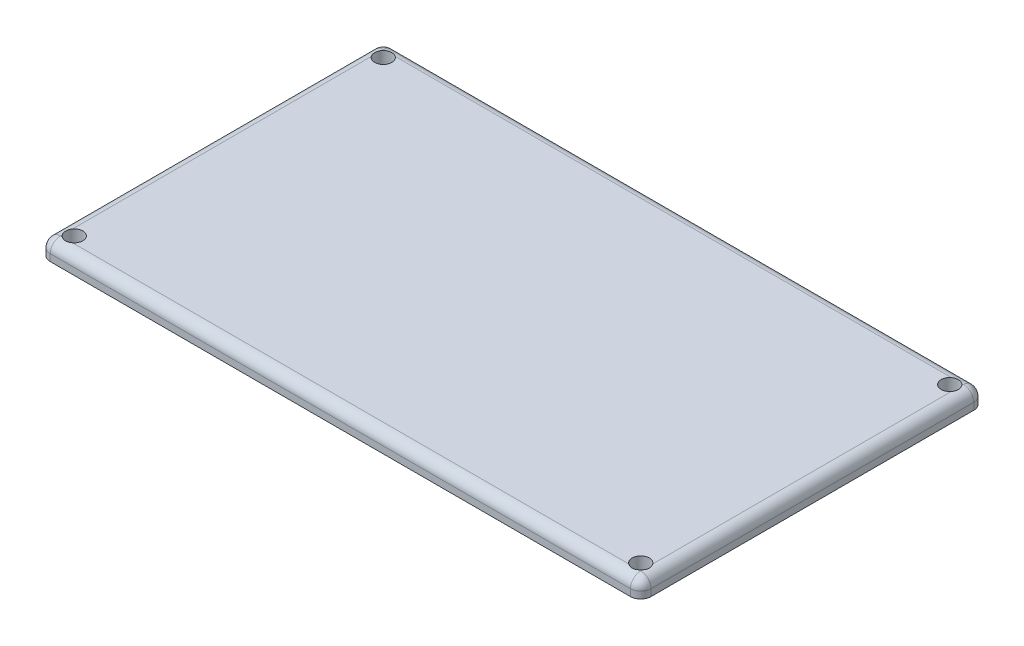
ISO-10303-21;
HEADER;
FILE_DESCRIPTION(('STEP AP214'),'2;1');
FILE_NAME('part.step','',(''),(''),'','','');
FILE_SCHEMA(('AUTOMOTIVE_DESIGN { 1 0 10303 214 1 1 1 1 }'));
ENDSEC;
DATA;
#1=APPLICATION_CONTEXT('core data for automotive mechanical design processes');
#2=APPLICATION_PROTOCOL_DEFINITION('international standard','automotive_design',2000,#1);
#3=PRODUCT_CONTEXT('',#1,'mechanical');
#4=PRODUCT('Part','Part','',(#3));
#5=PRODUCT_RELATED_PRODUCT_CATEGORY('part','',(#4));
#6=PRODUCT_DEFINITION_FORMATION('','',#4);
#7=PRODUCT_DEFINITION_CONTEXT('part definition',#1,'design');
#8=PRODUCT_DEFINITION('design','',#6,#7);
#9=PRODUCT_DEFINITION_SHAPE('','',#8);
#10=(LENGTH_UNIT() NAMED_UNIT(*) SI_UNIT(.MILLI.,.METRE.));
#11=(NAMED_UNIT(*) PLANE_ANGLE_UNIT() SI_UNIT($,.RADIAN.));
#12=(NAMED_UNIT(*) SI_UNIT($,.STERADIAN.) SOLID_ANGLE_UNIT());
#13=UNCERTAINTY_MEASURE_WITH_UNIT(LENGTH_MEASURE(1.E-05),#10,'distance_accuracy_value','');
#14=(GEOMETRIC_REPRESENTATION_CONTEXT(3) GLOBAL_UNCERTAINTY_ASSIGNED_CONTEXT((#13)) GLOBAL_UNIT_ASSIGNED_CONTEXT((#10,
#11,#12)) REPRESENTATION_CONTEXT('',''));
#15=CARTESIAN_POINT('',(0.,0.,0.));
#16=DIRECTION('',(0.,0.,1.));
#17=DIRECTION('',(1.,0.,0.));
#18=AXIS2_PLACEMENT_3D('',#15,#16,#17);
#19=CARTESIAN_POINT('',(0.,5.,0.));
#20=DIRECTION('',(0.,1.,0.));
#21=DIRECTION('',(0.,0.,1.));
#22=AXIS2_PLACEMENT_3D('',#19,#20,#21);
#23=PLANE('',#22);
#24=CARTESIAN_POINT('',(-82.5,5.,-45.));
#25=DIRECTION('',(0.,1.,0.));
#26=DIRECTION('',(0.,0.,1.));
#27=AXIS2_PLACEMENT_3D('',#24,#25,#26);
#28=CIRCLE('',#27,2.50000000000001);
#29=CARTESIAN_POINT('',(-84.5,5.,-43.5));
#30=VERTEX_POINT('',#29);
#31=CARTESIAN_POINT('',(-81.,5.,-47.));
#32=VERTEX_POINT('',#31);
#33=EDGE_CURVE('E165',#30,#32,#28,.T.);
#34=ORIENTED_EDGE('',*,*,#33,.F.);
#35=DIRECTION('',(0.,0.,1.));
#36=VECTOR('',#35,1.);
#37=CARTESIAN_POINT('',(-84.5,5.,50.));
#38=LINE('',#37,#36);
#39=CARTESIAN_POINT('',(-84.5,5.,43.5));
#40=VERTEX_POINT('',#39);
#41=EDGE_CURVE('E160',#30,#40,#38,.T.);
#42=ORIENTED_EDGE('',*,*,#41,.T.);
#43=CARTESIAN_POINT('',(-82.5,5.,45.));
#44=DIRECTION('',(0.,1.,0.));
#45=DIRECTION('',(0.,0.,-1.));
#46=AXIS2_PLACEMENT_3D('',#43,#44,#45);
#47=CIRCLE('',#46,2.5);
#48=CARTESIAN_POINT('',(-81.,5.,47.));
#49=VERTEX_POINT('',#48);
#50=EDGE_CURVE('E162',#49,#40,#47,.T.);
#51=ORIENTED_EDGE('',*,*,#50,.F.);
#52=DIRECTION('',(1.,0.,0.));
#53=VECTOR('',#52,1.);
#54=CARTESIAN_POINT('',(87.5,5.,47.));
#55=LINE('',#54,#53);
#56=CARTESIAN_POINT('',(81.,5.,47.));
#57=VERTEX_POINT('',#56);
#58=EDGE_CURVE('E275',#49,#57,#55,.T.);
#59=ORIENTED_EDGE('',*,*,#58,.T.);
#60=CARTESIAN_POINT('',(82.5,5.,45.));
#61=DIRECTION('',(0.,1.,0.));
#62=DIRECTION('',(0.,0.,1.));
#63=AXIS2_PLACEMENT_3D('',#60,#61,#62);
#64=CIRCLE('',#63,2.5);
#65=CARTESIAN_POINT('',(84.5,5.,43.5));
#66=VERTEX_POINT('',#65);
#67=EDGE_CURVE('E354',#66,#57,#64,.T.);
#68=ORIENTED_EDGE('',*,*,#67,.F.);
#69=DIRECTION('',(0.,0.,-1.));
#70=VECTOR('',#69,1.);
#71=CARTESIAN_POINT('',(84.5,5.,-50.));
#72=LINE('',#71,#70);
#73=CARTESIAN_POINT('',(84.5,5.,-43.5));
#74=VERTEX_POINT('',#73);
#75=EDGE_CURVE('E269',#66,#74,#72,.T.);
#76=ORIENTED_EDGE('',*,*,#75,.T.);
#77=CARTESIAN_POINT('',(82.5,5.,-45.));
#78=DIRECTION('',(0.,1.,0.));
#79=DIRECTION('',(0.,0.,-1.));
#80=AXIS2_PLACEMENT_3D('',#77,#78,#79);
#81=CIRCLE('',#80,2.50000000000001);
#82=CARTESIAN_POINT('',(81.,5.,-47.));
#83=VERTEX_POINT('',#82);
#84=EDGE_CURVE('E343',#83,#74,#81,.T.);
#85=ORIENTED_EDGE('',*,*,#84,.F.);
#86=DIRECTION('',(-1.,0.,0.));
#87=VECTOR('',#86,1.);
#88=CARTESIAN_POINT('',(-87.5,5.,-47.));
#89=LINE('',#88,#87);
#90=EDGE_CURVE('E257',#83,#32,#89,.T.);
#91=ORIENTED_EDGE('',*,*,#90,.T.);
#92=EDGE_LOOP('',(#34,#42,#51,#59,#68,#76,#85,#91));
#93=FACE_BOUND('',#92,.T.);
#94=ADVANCED_FACE('F34',(#93),#23,.T.);
#95=CARTESIAN_POINT('',(-84.5,5.,46.5));
#96=VERTEX_POINT('',#95);
#97=CARTESIAN_POINT('',(-83.9999999999999,5.,47.));
#98=VERTEX_POINT('',#97);
#99=EDGE_CURVE('E178',#96,#98,#47,.T.);
#100=ORIENTED_EDGE('',*,*,#99,.F.);
#101=DIRECTION('',(0.,0.,1.));
#102=VECTOR('',#101,1.);
#103=CARTESIAN_POINT('',(-84.5,5.,50.));
#104=LINE('',#103,#102);
#105=CARTESIAN_POINT('',(-84.5,5.,47.));
#106=VERTEX_POINT('',#105);
#107=EDGE_CURVE('E169',#96,#106,#104,.T.);
#108=ORIENTED_EDGE('',*,*,#107,.T.);
#109=DIRECTION('',(1.,0.,0.));
#110=VECTOR('',#109,1.);
#111=CARTESIAN_POINT('',(87.5,5.,47.));
#112=LINE('',#111,#110);
#113=EDGE_CURVE('E277',#106,#98,#112,.T.);
#114=ORIENTED_EDGE('',*,*,#113,.T.);
#115=EDGE_LOOP('',(#100,#108,#114));
#116=FACE_BOUND('',#115,.T.);
#117=ADVANCED_FACE('F281',(#116),#23,.T.);
#118=CARTESIAN_POINT('',(84.,5.,47.));
#119=VERTEX_POINT('',#118);
#120=CARTESIAN_POINT('',(84.5,5.,46.5));
#121=VERTEX_POINT('',#120);
#122=EDGE_CURVE('E348',#119,#121,#64,.T.);
#123=ORIENTED_EDGE('',*,*,#122,.F.);
#124=DIRECTION('',(1.,0.,0.));
#125=VECTOR('',#124,1.);
#126=CARTESIAN_POINT('',(87.5,5.,47.));
#127=LINE('',#126,#125);
#128=CARTESIAN_POINT('',(84.5,5.,47.));
#129=VERTEX_POINT('',#128);
#130=EDGE_CURVE('E273',#119,#129,#127,.T.);
#131=ORIENTED_EDGE('',*,*,#130,.T.);
#132=DIRECTION('',(0.,0.,-1.));
#133=VECTOR('',#132,1.);
#134=CARTESIAN_POINT('',(84.5,5.,-50.));
#135=LINE('',#134,#133);
#136=EDGE_CURVE('E271',#129,#121,#135,.T.);
#137=ORIENTED_EDGE('',*,*,#136,.T.);
#138=EDGE_LOOP('',(#123,#131,#137));
#139=FACE_BOUND('',#138,.T.);
#140=ADVANCED_FACE('F427',(#139),#23,.T.);
#141=CARTESIAN_POINT('',(84.5,5.,-46.5));
#142=VERTEX_POINT('',#141);
#143=CARTESIAN_POINT('',(84.,5.,-47.));
#144=VERTEX_POINT('',#143);
#145=EDGE_CURVE('E336',#142,#144,#81,.T.);
#146=ORIENTED_EDGE('',*,*,#145,.F.);
#147=DIRECTION('',(0.,0.,-1.));
#148=VECTOR('',#147,1.);
#149=CARTESIAN_POINT('',(84.5,5.,-50.));
#150=LINE('',#149,#148);
#151=CARTESIAN_POINT('',(84.5,5.,-47.));
#152=VERTEX_POINT('',#151);
#153=EDGE_CURVE('E267',#142,#152,#150,.T.);
#154=ORIENTED_EDGE('',*,*,#153,.T.);
#155=DIRECTION('',(-1.,0.,0.));
#156=VECTOR('',#155,1.);
#157=CARTESIAN_POINT('',(-87.5,5.,-47.));
#158=LINE('',#157,#156);
#159=EDGE_CURVE('E265',#152,#144,#158,.T.);
#160=ORIENTED_EDGE('',*,*,#159,.T.);
#161=EDGE_LOOP('',(#146,#154,#160));
#162=FACE_BOUND('',#161,.T.);
#163=ADVANCED_FACE('F335',(#162),#23,.T.);
#164=CARTESIAN_POINT('',(87.5,5.,-50.));
#165=DIRECTION('',(-1.,0.,0.));
#166=DIRECTION('',(0.,0.,1.));
#167=AXIS2_PLACEMENT_3D('',#164,#165,#166);
#168=PLANE('',#167);
#169=DIRECTION('',(0.,0.,-1.));
#170=VECTOR('',#169,1.);
#171=CARTESIAN_POINT('',(87.5,2.,50.));
#172=LINE('',#171,#170);
#173=CARTESIAN_POINT('',(87.5,2.,-47.));
#174=VERTEX_POINT('',#173);
#175=CARTESIAN_POINT('',(87.5,2.,47.));
#176=VERTEX_POINT('',#175);
#177=EDGE_CURVE('E461',#174,#176,#172,.F.);
#178=ORIENTED_EDGE('',*,*,#177,.T.);
#179=DIRECTION('',(0.,-1.,0.));
#180=VECTOR('',#179,1.);
#181=CARTESIAN_POINT('',(87.5,5.,47.));
#182=LINE('',#181,#180);
#183=CARTESIAN_POINT('',(87.5,0.,47.));
#184=VERTEX_POINT('',#183);
#185=EDGE_CURVE('E473',#176,#184,#182,.T.);
#186=ORIENTED_EDGE('',*,*,#185,.T.);
#187=DIRECTION('',(0.,0.,-1.));
#188=VECTOR('',#187,1.);
#189=CARTESIAN_POINT('',(87.5,0.,-50.));
#190=LINE('',#189,#188);
#191=CARTESIAN_POINT('',(87.5,0.,-47.));
#192=VERTEX_POINT('',#191);
#193=EDGE_CURVE('E359',#184,#192,#190,.T.);
#194=ORIENTED_EDGE('',*,*,#193,.T.);
#195=DIRECTION('',(0.,-1.,0.));
#196=VECTOR('',#195,1.);
#197=CARTESIAN_POINT('',(87.5,5.,-47.));
#198=LINE('',#197,#196);
#199=EDGE_CURVE('E407',#192,#174,#198,.F.);
#200=ORIENTED_EDGE('',*,*,#199,.T.);
#201=EDGE_LOOP('',(#178,#186,#194,#200));
#202=FACE_BOUND('',#201,.T.);
#203=ADVANCED_FACE('F438',(#202),#168,.F.);
#204=CARTESIAN_POINT('',(-87.5,5.,-50.));
#205=DIRECTION('',(0.,0.,1.));
#206=DIRECTION('',(1.,0.,0.));
#207=AXIS2_PLACEMENT_3D('',#204,#205,#206);
#208=PLANE('',#207);
#209=DIRECTION('',(-1.,0.,0.));
#210=VECTOR('',#209,1.);
#211=CARTESIAN_POINT('',(87.5,2.,-50.));
#212=LINE('',#211,#210);
#213=CARTESIAN_POINT('',(-84.5,2.,-50.));
#214=VERTEX_POINT('',#213);
#215=CARTESIAN_POINT('',(84.5,2.,-50.));
#216=VERTEX_POINT('',#215);
#217=EDGE_CURVE('E51',#214,#216,#212,.F.);
#218=ORIENTED_EDGE('',*,*,#217,.T.);
#219=DIRECTION('',(0.,-1.,0.));
#220=VECTOR('',#219,1.);
#221=CARTESIAN_POINT('',(84.5,5.,-50.));
#222=LINE('',#221,#220);
#223=CARTESIAN_POINT('',(84.5,0.,-50.));
#224=VERTEX_POINT('',#223);
#225=EDGE_CURVE('E479',#216,#224,#222,.T.);
#226=ORIENTED_EDGE('',*,*,#225,.T.);
#227=DIRECTION('',(-1.,0.,0.));
#228=VECTOR('',#227,1.);
#229=CARTESIAN_POINT('',(-87.5,0.,-50.));
#230=LINE('',#229,#228);
#231=CARTESIAN_POINT('',(-84.5,0.,-50.));
#232=VERTEX_POINT('',#231);
#233=EDGE_CURVE('E363',#224,#232,#230,.T.);
#234=ORIENTED_EDGE('',*,*,#233,.T.);
#235=DIRECTION('',(0.,-1.,0.));
#236=VECTOR('',#235,1.);
#237=CARTESIAN_POINT('',(-84.5,5.,-50.));
#238=LINE('',#237,#236);
#239=EDGE_CURVE('E56',#232,#214,#238,.F.);
#240=ORIENTED_EDGE('',*,*,#239,.T.);
#241=EDGE_LOOP('',(#218,#226,#234,#240));
#242=FACE_BOUND('',#241,.T.);
#243=ADVANCED_FACE('F443',(#242),#208,.F.);
#244=CARTESIAN_POINT('',(-87.5,5.,-50.));
#245=DIRECTION('',(1.,0.,0.));
#246=DIRECTION('',(0.,0.,-1.));
#247=AXIS2_PLACEMENT_3D('',#244,#245,#246);
#248=PLANE('',#247);
#249=DIRECTION('',(0.,0.,1.));
#250=VECTOR('',#249,1.);
#251=CARTESIAN_POINT('',(-87.5,0.,-50.));
#252=LINE('',#251,#250);
#253=CARTESIAN_POINT('',(-87.5,0.,-47.));
#254=VERTEX_POINT('',#253);
#255=CARTESIAN_POINT('',(-87.5,0.,47.));
#256=VERTEX_POINT('',#255);
#257=EDGE_CURVE('E260',#254,#256,#252,.T.);
#258=ORIENTED_EDGE('',*,*,#257,.T.);
#259=DIRECTION('',(0.,-1.,0.));
#260=VECTOR('',#259,1.);
#261=CARTESIAN_POINT('',(-87.5,5.,47.));
#262=LINE('',#261,#260);
#263=CARTESIAN_POINT('',(-87.5,2.,47.));
#264=VERTEX_POINT('',#263);
#265=EDGE_CURVE('E369',#256,#264,#262,.F.);
#266=ORIENTED_EDGE('',*,*,#265,.T.);
#267=DIRECTION('',(0.,0.,1.));
#268=VECTOR('',#267,1.);
#269=CARTESIAN_POINT('',(-87.5,2.,-50.));
#270=LINE('',#269,#268);
#271=CARTESIAN_POINT('',(-87.5,2.,-47.));
#272=VERTEX_POINT('',#271);
#273=EDGE_CURVE('E185',#264,#272,#270,.F.);
#274=ORIENTED_EDGE('',*,*,#273,.T.);
#275=DIRECTION('',(0.,-1.,0.));
#276=VECTOR('',#275,1.);
#277=CARTESIAN_POINT('',(-87.5,5.,-47.));
#278=LINE('',#277,#276);
#279=EDGE_CURVE('E183',#272,#254,#278,.T.);
#280=ORIENTED_EDGE('',*,*,#279,.T.);
#281=EDGE_LOOP('',(#258,#266,#274,#280));
#282=FACE_BOUND('',#281,.T.);
#283=ADVANCED_FACE('F368',(#282),#248,.F.);
#284=CARTESIAN_POINT('',(-87.5,5.,50.));
#285=DIRECTION('',(0.,0.,-1.));
#286=DIRECTION('',(-1.,0.,0.));
#287=AXIS2_PLACEMENT_3D('',#284,#285,#286);
#288=PLANE('',#287);
#289=DIRECTION('',(1.,0.,0.));
#290=VECTOR('',#289,1.);
#291=CARTESIAN_POINT('',(-87.5,0.,50.));
#292=LINE('',#291,#290);
#293=CARTESIAN_POINT('',(-84.5,0.,50.));
#294=VERTEX_POINT('',#293);
#295=CARTESIAN_POINT('',(84.5,0.,50.));
#296=VERTEX_POINT('',#295);
#297=EDGE_CURVE('E255',#294,#296,#292,.T.);
#298=ORIENTED_EDGE('',*,*,#297,.T.);
#299=DIRECTION('',(0.,-1.,0.));
#300=VECTOR('',#299,1.);
#301=CARTESIAN_POINT('',(84.5,5.,50.));
#302=LINE('',#301,#300);
#303=CARTESIAN_POINT('',(84.5,2.,50.));
#304=VERTEX_POINT('',#303);
#305=EDGE_CURVE('E467',#296,#304,#302,.F.);
#306=ORIENTED_EDGE('',*,*,#305,.T.);
#307=DIRECTION('',(1.,0.,0.));
#308=VECTOR('',#307,1.);
#309=CARTESIAN_POINT('',(-87.5,2.,50.));
#310=LINE('',#309,#308);
#311=CARTESIAN_POINT('',(-84.5,2.,50.));
#312=VERTEX_POINT('',#311);
#313=EDGE_CURVE('E455',#304,#312,#310,.F.);
#314=ORIENTED_EDGE('',*,*,#313,.T.);
#315=DIRECTION('',(0.,-1.,0.));
#316=VECTOR('',#315,1.);
#317=CARTESIAN_POINT('',(-84.5,5.,50.));
#318=LINE('',#317,#316);
#319=EDGE_CURVE('E465',#312,#294,#318,.T.);
#320=ORIENTED_EDGE('',*,*,#319,.T.);
#321=EDGE_LOOP('',(#298,#306,#314,#320));
#322=FACE_BOUND('',#321,.T.);
#323=ADVANCED_FACE('F429',(#322),#288,.F.);
#324=DIRECTION('',(-1.,0.,0.));
#325=VECTOR('',#324,1.);
#326=CARTESIAN_POINT('',(-87.5,5.,-47.));
#327=LINE('',#326,#325);
#328=CARTESIAN_POINT('',(-84.,5.,-47.));
#329=VERTEX_POINT('',#328);
#330=CARTESIAN_POINT('',(-84.5,5.,-47.));
#331=VERTEX_POINT('',#330);
#332=EDGE_CURVE('E244',#329,#331,#327,.T.);
#333=ORIENTED_EDGE('',*,*,#332,.T.);
#334=DIRECTION('',(0.,0.,1.));
#335=VECTOR('',#334,1.);
#336=CARTESIAN_POINT('',(-84.5,5.,50.));
#337=LINE('',#336,#335);
#338=CARTESIAN_POINT('',(-84.5,5.,-46.5));
#339=VERTEX_POINT('',#338);
#340=EDGE_CURVE('E247',#331,#339,#337,.T.);
#341=ORIENTED_EDGE('',*,*,#340,.T.);
#342=EDGE_CURVE('E238',#329,#339,#28,.T.);
#343=ORIENTED_EDGE('',*,*,#342,.F.);
#344=EDGE_LOOP('',(#333,#341,#343));
#345=FACE_BOUND('',#344,.T.);
#346=ADVANCED_FACE('F221',(#345),#23,.T.);
#347=CARTESIAN_POINT('',(0.,0.,0.));
#348=DIRECTION('',(0.,1.,0.));
#349=DIRECTION('',(0.,0.,1.));
#350=AXIS2_PLACEMENT_3D('',#347,#348,#349);
#351=PLANE('',#350);
#352=CARTESIAN_POINT('',(-82.5,0.,45.));
#353=DIRECTION('',(0.,1.,0.));
#354=DIRECTION('',(0.,0.,-1.));
#355=AXIS2_PLACEMENT_3D('',#352,#353,#354);
#356=CIRCLE('',#355,2.5);
#357=CARTESIAN_POINT('',(-82.5,0.,42.5));
#358=VERTEX_POINT('',#357);
#359=EDGE_CURVE('E355',#358,#358,#356,.T.);
#360=ORIENTED_EDGE('',*,*,#359,.T.);
#361=EDGE_LOOP('',(#360));
#362=FACE_BOUND('',#361,.T.);
#363=CARTESIAN_POINT('',(82.5,0.,45.));
#364=DIRECTION('',(0.,1.,0.));
#365=DIRECTION('',(0.,0.,1.));
#366=AXIS2_PLACEMENT_3D('',#363,#364,#365);
#367=CIRCLE('',#366,2.5);
#368=CARTESIAN_POINT('',(82.5,0.,47.5));
#369=VERTEX_POINT('',#368);
#370=EDGE_CURVE('E344',#369,#369,#367,.T.);
#371=ORIENTED_EDGE('',*,*,#370,.T.);
#372=EDGE_LOOP('',(#371));
#373=FACE_BOUND('',#372,.T.);
#374=CARTESIAN_POINT('',(82.5,0.,-45.));
#375=DIRECTION('',(0.,1.,0.));
#376=DIRECTION('',(0.,0.,-1.));
#377=AXIS2_PLACEMENT_3D('',#374,#375,#376);
#378=CIRCLE('',#377,2.50000000000001);
#379=CARTESIAN_POINT('',(82.5,0.,-47.5));
#380=VERTEX_POINT('',#379);
#381=EDGE_CURVE('E346',#380,#380,#378,.T.);
#382=ORIENTED_EDGE('',*,*,#381,.T.);
#383=EDGE_LOOP('',(#382));
#384=FACE_BOUND('',#383,.T.);
#385=CARTESIAN_POINT('',(-82.5,0.,-45.));
#386=DIRECTION('',(0.,1.,0.));
#387=DIRECTION('',(0.,0.,1.));
#388=AXIS2_PLACEMENT_3D('',#385,#386,#387);
#389=CIRCLE('',#388,2.50000000000001);
#390=CARTESIAN_POINT('',(-82.5,0.,-42.5));
#391=VERTEX_POINT('',#390);
#392=EDGE_CURVE('E248',#391,#391,#389,.T.);
#393=ORIENTED_EDGE('',*,*,#392,.T.);
#394=EDGE_LOOP('',(#393));
#395=FACE_BOUND('',#394,.T.);
#396=ORIENTED_EDGE('',*,*,#193,.F.);
#397=CARTESIAN_POINT('',(84.5,0.,47.));
#398=DIRECTION('',(0.,1.,0.));
#399=DIRECTION('',(0.,0.,1.));
#400=AXIS2_PLACEMENT_3D('',#397,#398,#399);
#401=CIRCLE('',#400,3.);
#402=EDGE_CURVE('E11',#184,#296,#401,.F.);
#403=ORIENTED_EDGE('',*,*,#402,.T.);
#404=ORIENTED_EDGE('',*,*,#297,.F.);
#405=CARTESIAN_POINT('',(-84.5,0.,47.));
#406=DIRECTION('',(0.,1.,0.));
#407=DIRECTION('',(0.,0.,1.));
#408=AXIS2_PLACEMENT_3D('',#405,#406,#407);
#409=CIRCLE('',#408,3.);
#410=EDGE_CURVE('E377',#294,#256,#409,.F.);
#411=ORIENTED_EDGE('',*,*,#410,.T.);
#412=ORIENTED_EDGE('',*,*,#257,.F.);
#413=CARTESIAN_POINT('',(-84.5,0.,-47.));
#414=DIRECTION('',(0.,1.,0.));
#415=DIRECTION('',(0.,0.,1.));
#416=AXIS2_PLACEMENT_3D('',#413,#414,#415);
#417=CIRCLE('',#416,3.);
#418=EDGE_CURVE('E481',#254,#232,#417,.F.);
#419=ORIENTED_EDGE('',*,*,#418,.T.);
#420=ORIENTED_EDGE('',*,*,#233,.F.);
#421=CARTESIAN_POINT('',(84.5,0.,-47.));
#422=DIRECTION('',(0.,1.,0.));
#423=DIRECTION('',(0.,0.,1.));
#424=AXIS2_PLACEMENT_3D('',#421,#422,#423);
#425=CIRCLE('',#424,3.);
#426=EDGE_CURVE('E43',#224,#192,#425,.F.);
#427=ORIENTED_EDGE('',*,*,#426,.T.);
#428=EDGE_LOOP('',(#396,#403,#404,#411,#412,#419,#420,#427));
#429=FACE_BOUND('',#428,.T.);
#430=ADVANCED_FACE('F219',(#362,#373,#384,#395,#429),#351,.F.);
#431=CARTESIAN_POINT('',(-82.5,0.,-45.));
#432=DIRECTION('',(0.,1.,0.));
#433=DIRECTION('',(0.,0.,1.));
#434=AXIS2_PLACEMENT_3D('',#431,#432,#433);
#435=CYLINDRICAL_SURFACE('',#434,2.50000000000001);
#436=ORIENTED_EDGE('',*,*,#392,.F.);
#437=EDGE_LOOP('',(#436));
#438=FACE_BOUND('',#437,.T.);
#439=ORIENTED_EDGE('',*,*,#342,.T.);
#440=CARTESIAN_POINT('',(-84.5,5.,-46.5));
#441=CARTESIAN_POINT('',(-84.5420704461217,4.99999332193425,-46.4439173670414));
#442=CARTESIAN_POINT('',(-84.5817619315182,4.99911482948799,-46.3860690408133));
#443=CARTESIAN_POINT('',(-84.6561314641283,4.99616721008799,-46.2672797058176));
#444=CARTESIAN_POINT('',(-84.6908106348321,4.99409835046975,-46.2063393942566));
#445=CARTESIAN_POINT('',(-84.7549209167581,4.98932235877924,-46.0817757626455));
#446=CARTESIAN_POINT('',(-84.7843517356934,4.98661519117833,-46.018152293411));
#447=CARTESIAN_POINT('',(-84.8377666928871,4.98104504226884,-45.8886831039609));
#448=CARTESIAN_POINT('',(-84.8617506359338,4.97818205538038,-45.8228373041959));
#449=CARTESIAN_POINT('',(-84.9252677665956,4.97001979214978,-45.6226069742142));
#450=CARTESIAN_POINT('',(-84.9564175077952,4.96514201351039,-45.4854297200601));
#451=CARTESIAN_POINT('',(-84.9952818209267,4.95889954464957,-45.2078766600723));
#452=CARTESIAN_POINT('',(-85.0030133308165,4.95753231542409,-45.0675032400393));
#453=CARTESIAN_POINT('',(-84.9949019595401,4.95889947246016,-44.7881247156143));
#454=CARTESIAN_POINT('',(-84.9791722381858,4.96161417100129,-44.6491162773595));
#455=CARTESIAN_POINT('',(-84.9248052662771,4.96989699091218,-44.3756890521871));
#456=CARTESIAN_POINT('',(-84.8861580065136,4.97546635891137,-44.2412722978274));
#457=CARTESIAN_POINT('',(-84.7951078574183,4.98573760713422,-44.0019515477298));
#458=CARTESIAN_POINT('',(-84.745962252363,4.99043333550333,-43.8958019606199));
#459=CARTESIAN_POINT('',(-84.661541089698,4.99577955942664,-43.7425648779645));
#460=CARTESIAN_POINT('',(-84.6316281765363,4.99727853114346,-43.6924987771515));
#461=CARTESIAN_POINT('',(-84.5683605533357,4.99938758489702,-43.5945517818845));
#462=CARTESIAN_POINT('',(-84.5350048616878,4.99999741266619,-43.546671516302));
#463=CARTESIAN_POINT('',(-84.5,5.,-43.5));
#464=B_SPLINE_CURVE_WITH_KNOTS('',3,(#440,#441,#442,#443,#444,#445,#446,#447,#448,#449,#450,
#451,#452,#453,#454,#455,#456,#457,#458,#459,#460,#461,#462,#463),.UNSPECIFIED.,.F.,.F.,(4,2,2,
2,2,2,2,2,2,2,2,4),(0.,0.210235486583612,0.420423776401091,0.63062376820268,0.840831292217668,
1.26091362427923,1.68069204620186,2.09845230086934,2.51639514637855,2.8663990104264,
3.04128920196876,3.21622939687739),.UNSPECIFIED.);
#465=EDGE_CURVE('E187',#339,#30,#464,.T.);
#466=ORIENTED_EDGE('',*,*,#465,.T.);
#467=ORIENTED_EDGE('',*,*,#33,.T.);
#468=CARTESIAN_POINT('',(-81.,5.,-47.));
#469=CARTESIAN_POINT('',(-81.0560826329586,4.99999332193425,-47.0420704461217));
#470=CARTESIAN_POINT('',(-81.1139309591867,4.99911482948799,-47.0817619315182));
#471=CARTESIAN_POINT('',(-81.2327202941824,4.99616721008799,-47.1561314641283));
#472=CARTESIAN_POINT('',(-81.2936606057434,4.99409835046975,-47.1908106348321));
#473=CARTESIAN_POINT('',(-81.4182242373545,4.98932235877924,-47.2549209167581));
#474=CARTESIAN_POINT('',(-81.481847706589,4.98661519117833,-47.2843517356934));
#475=CARTESIAN_POINT('',(-81.6113168960391,4.98104504226884,-47.3377666928871));
#476=CARTESIAN_POINT('',(-81.6771626958041,4.97818205538039,-47.3617506359338));
#477=CARTESIAN_POINT('',(-81.8773930257858,4.97001979214978,-47.4252677665956));
#478=CARTESIAN_POINT('',(-82.0145702799399,4.9651420135104,-47.4564175077952));
#479=CARTESIAN_POINT('',(-82.2921233399277,4.95889954464957,-47.4952818209267));
#480=CARTESIAN_POINT('',(-82.4324967599607,4.9575323154241,-47.5030133308165));
#481=CARTESIAN_POINT('',(-82.7118752843857,4.95889947246016,-47.4949019595401));
#482=CARTESIAN_POINT('',(-82.8508837226405,4.96161417100129,-47.4791722381858));
#483=CARTESIAN_POINT('',(-83.1243109478128,4.96989699091218,-47.4248052662771));
#484=CARTESIAN_POINT('',(-83.2587277021726,4.97546635891138,-47.3861580065136));
#485=CARTESIAN_POINT('',(-83.4980484522702,4.98573760713422,-47.2951078574183));
#486=CARTESIAN_POINT('',(-83.60419803938,4.99043333550333,-47.245962252363));
#487=CARTESIAN_POINT('',(-83.7574351220354,4.99577955942664,-47.161541089698));
#488=CARTESIAN_POINT('',(-83.8075012228484,4.99727853114346,-47.1316281765363));
#489=CARTESIAN_POINT('',(-83.9054482181154,4.99938758489702,-47.0683605533357));
#490=CARTESIAN_POINT('',(-83.9533284836979,4.99999741266619,-47.0350048616878));
#491=CARTESIAN_POINT('',(-84.,5.,-47.));
#492=B_SPLINE_CURVE_WITH_KNOTS('',3,(#468,#469,#470,#471,#472,#473,#474,#475,#476,#477,#478,
#479,#480,#481,#482,#483,#484,#485,#486,#487,#488,#489,#490,#491),.UNSPECIFIED.,.F.,.F.,(4,2,2,
2,2,2,2,2,2,2,2,4),(0.,0.210235486583606,0.420423776401103,0.630623768202701,0.840831292217678,
1.26091362427921,1.68069204620186,2.09845230086934,2.51639514637856,2.86639901042637,
3.04128920196871,3.21622939687733),.UNSPECIFIED.);
#493=EDGE_CURVE('E168',#32,#329,#492,.T.);
#494=ORIENTED_EDGE('',*,*,#493,.T.);
#495=EDGE_LOOP('',(#439,#466,#467,#494));
#496=FACE_BOUND('',#495,.T.);
#497=ADVANCED_FACE('F213',(#438,#496),#435,.F.);
#498=CARTESIAN_POINT('',(82.5,0.,-45.));
#499=DIRECTION('',(0.,1.,0.));
#500=DIRECTION('',(0.,0.,1.));
#501=AXIS2_PLACEMENT_3D('',#498,#499,#500);
#502=CYLINDRICAL_SURFACE('',#501,2.50000000000001);
#503=ORIENTED_EDGE('',*,*,#381,.F.);
#504=EDGE_LOOP('',(#503));
#505=FACE_BOUND('',#504,.T.);
#506=ORIENTED_EDGE('',*,*,#84,.T.);
#507=CARTESIAN_POINT('',(84.5,5.,-43.5));
#508=CARTESIAN_POINT('',(84.5420704461217,4.99999332193425,-43.5560826329586));
#509=CARTESIAN_POINT('',(84.5817619315183,4.99911482948799,-43.6139309591868));
#510=CARTESIAN_POINT('',(84.6561314641283,4.99616721008799,-43.7327202941824));
#511=CARTESIAN_POINT('',(84.6908106348321,4.99409835046975,-43.7936606057435));
#512=CARTESIAN_POINT('',(84.7549209167581,4.98932235877924,-43.9182242373546));
#513=CARTESIAN_POINT('',(84.7843517356934,4.98661519117833,-43.9818477065891));
#514=CARTESIAN_POINT('',(84.8377666928871,4.98104504226885,-44.1113168960391));
#515=CARTESIAN_POINT('',(84.8617506359338,4.97818205538039,-44.1771626958041));
#516=CARTESIAN_POINT('',(84.9252677665956,4.97001979214978,-44.3773930257859));
#517=CARTESIAN_POINT('',(84.9564175077952,4.9651420135104,-44.5145702799399));
#518=CARTESIAN_POINT('',(84.9952818209267,4.95889954464957,-44.7921233399278));
#519=CARTESIAN_POINT('',(85.0030133308165,4.9575323154241,-44.9324967599608));
#520=CARTESIAN_POINT('',(84.99490195954,4.95889947246016,-45.2118752843858));
#521=CARTESIAN_POINT('',(84.9791722381858,4.96161417100129,-45.3508837226405));
#522=CARTESIAN_POINT('',(84.9248052662771,4.96989699091219,-45.6243109478129));
#523=CARTESIAN_POINT('',(84.8861580065136,4.97546635891138,-45.7587277021727));
#524=CARTESIAN_POINT('',(84.7951078574182,4.98573760713422,-45.9980484522703));
#525=CARTESIAN_POINT('',(84.745962252363,4.99043333550333,-46.1041980393801));
#526=CARTESIAN_POINT('',(84.661541089698,4.99577955942664,-46.2574351220355));
#527=CARTESIAN_POINT('',(84.6316281765363,4.99727853114346,-46.3075012228484));
#528=CARTESIAN_POINT('',(84.5683605533357,4.99938758489703,-46.4054482181154));
#529=CARTESIAN_POINT('',(84.5350048616878,4.99999741266619,-46.453328483698));
#530=CARTESIAN_POINT('',(84.5,5.,-46.5));
#531=B_SPLINE_CURVE_WITH_KNOTS('',3,(#507,#508,#509,#510,#511,#512,#513,#514,#515,#516,#517,
#518,#519,#520,#521,#522,#523,#524,#525,#526,#527,#528,#529,#530),.UNSPECIFIED.,.F.,.F.,(4,2,2,
2,2,2,2,2,2,2,2,4),(0.,0.210235486583631,0.420423776401109,0.630623768202685,0.8408312922177,
1.26091362427924,1.68069204620189,2.09845230086936,2.51639514637859,2.86639901042637,
3.0412892019687,3.2162293968773),.UNSPECIFIED.);
#532=EDGE_CURVE('E342',#74,#142,#531,.T.);
#533=ORIENTED_EDGE('',*,*,#532,.T.);
#534=ORIENTED_EDGE('',*,*,#145,.T.);
#535=CARTESIAN_POINT('',(84.,5.,-47.));
#536=CARTESIAN_POINT('',(83.9439173670414,4.99999332193425,-47.0420704461217));
#537=CARTESIAN_POINT('',(83.8860690408133,4.99911482948799,-47.0817619315183));
#538=CARTESIAN_POINT('',(83.7672797058176,4.99616721008799,-47.1561314641283));
#539=CARTESIAN_POINT('',(83.7063393942566,4.99409835046975,-47.1908106348321));
#540=CARTESIAN_POINT('',(83.5817757626455,4.98932235877924,-47.2549209167581));
#541=CARTESIAN_POINT('',(83.5181522934109,4.98661519117833,-47.2843517356934));
#542=CARTESIAN_POINT('',(83.3886831039609,4.98104504226884,-47.3377666928871));
#543=CARTESIAN_POINT('',(83.3228373041959,4.97818205538038,-47.3617506359338));
#544=CARTESIAN_POINT('',(83.1226069742142,4.97001979214978,-47.4252677665956));
#545=CARTESIAN_POINT('',(82.9854297200601,4.96514201351039,-47.4564175077952));
#546=CARTESIAN_POINT('',(82.7078766600723,4.95889954464957,-47.4952818209267));
#547=CARTESIAN_POINT('',(82.5675032400393,4.95753231542409,-47.5030133308165));
#548=CARTESIAN_POINT('',(82.2881247156143,4.95889947246016,-47.4949019595401));
#549=CARTESIAN_POINT('',(82.1491162773595,4.96161417100129,-47.4791722381858));
#550=CARTESIAN_POINT('',(81.8756890521871,4.96989699091218,-47.4248052662771));
#551=CARTESIAN_POINT('',(81.7412722978274,4.97546635891138,-47.3861580065136));
#552=CARTESIAN_POINT('',(81.5019515477297,4.98573760713422,-47.2951078574183));
#553=CARTESIAN_POINT('',(81.3958019606199,4.99043333550333,-47.245962252363));
#554=CARTESIAN_POINT('',(81.2425648779645,4.99577955942664,-47.161541089698));
#555=CARTESIAN_POINT('',(81.1924987771515,4.99727853114346,-47.1316281765363));
#556=CARTESIAN_POINT('',(81.0945517818845,4.99938758489702,-47.0683605533357));
#557=CARTESIAN_POINT('',(81.046671516302,4.99999741266619,-47.0350048616878));
#558=CARTESIAN_POINT('',(81.,5.,-47.));
#559=B_SPLINE_CURVE_WITH_KNOTS('',3,(#535,#536,#537,#538,#539,#540,#541,#542,#543,#544,#545,
#546,#547,#548,#549,#550,#551,#552,#553,#554,#555,#556,#557,#558),.UNSPECIFIED.,.F.,.F.,(4,2,2,
2,2,2,2,2,2,2,2,4),(0.,0.210235486583621,0.420423776401106,0.630623768202704,0.840831292217684,
1.26091362427921,1.68069204620187,2.09845230086936,2.51639514637857,2.86639901042642,
3.04128920196878,3.2162293968774),.UNSPECIFIED.);
#560=EDGE_CURVE('E331',#144,#83,#559,.T.);
#561=ORIENTED_EDGE('',*,*,#560,.T.);
#562=EDGE_LOOP('',(#506,#533,#534,#561));
#563=FACE_BOUND('',#562,.T.);
#564=ADVANCED_FACE('F218',(#505,#563),#502,.F.);
#565=CARTESIAN_POINT('',(82.5,0.,45.));
#566=DIRECTION('',(0.,1.,0.));
#567=DIRECTION('',(0.,0.,1.));
#568=AXIS2_PLACEMENT_3D('',#565,#566,#567);
#569=CYLINDRICAL_SURFACE('',#568,2.5);
#570=ORIENTED_EDGE('',*,*,#370,.F.);
#571=EDGE_LOOP('',(#570));
#572=FACE_BOUND('',#571,.T.);
#573=ORIENTED_EDGE('',*,*,#67,.T.);
#574=CARTESIAN_POINT('',(81.,5.,47.));
#575=CARTESIAN_POINT('',(81.0560826329586,4.99999332193426,47.0420704461217));
#576=CARTESIAN_POINT('',(81.1139309591868,4.99911482948799,47.0817619315182));
#577=CARTESIAN_POINT('',(81.2327202941824,4.99616721008799,47.1561314641283));
#578=CARTESIAN_POINT('',(81.2936606057434,4.99409835046975,47.1908106348321));
#579=CARTESIAN_POINT('',(81.4182242373546,4.98932235877924,47.2549209167581));
#580=CARTESIAN_POINT('',(81.4818477065891,4.98661519117833,47.2843517356934));
#581=CARTESIAN_POINT('',(81.6113168960391,4.98104504226884,47.3377666928871));
#582=CARTESIAN_POINT('',(81.6771626958041,4.97818205538039,47.3617506359338));
#583=CARTESIAN_POINT('',(81.8773930257858,4.97001979214978,47.4252677665956));
#584=CARTESIAN_POINT('',(82.0145702799399,4.9651420135104,47.4564175077952));
#585=CARTESIAN_POINT('',(82.2921233399277,4.95889954464957,47.4952818209267));
#586=CARTESIAN_POINT('',(82.4324967599607,4.9575323154241,47.5030133308165));
#587=CARTESIAN_POINT('',(82.7118752843858,4.95889947246016,47.4949019595401));
#588=CARTESIAN_POINT('',(82.8508837226405,4.96161417100129,47.4791722381858));
#589=CARTESIAN_POINT('',(83.1243109478129,4.96989699091219,47.4248052662771));
#590=CARTESIAN_POINT('',(83.2587277021726,4.97546635891138,47.3861580065136));
#591=CARTESIAN_POINT('',(83.4980484522702,4.98573760713422,47.2951078574182));
#592=CARTESIAN_POINT('',(83.6041980393801,4.99043333550333,47.245962252363));
#593=CARTESIAN_POINT('',(83.7574351220354,4.99577955942664,47.161541089698));
#594=CARTESIAN_POINT('',(83.8075012228484,4.99727853114346,47.1316281765363));
#595=CARTESIAN_POINT('',(83.9054482181154,4.99938758489703,47.0683605533357));
#596=CARTESIAN_POINT('',(83.9533284836979,4.99999741266619,47.0350048616878));
#597=CARTESIAN_POINT('',(84.,5.,47.));
#598=B_SPLINE_CURVE_WITH_KNOTS('',3,(#574,#575,#576,#577,#578,#579,#580,#581,#582,#583,#584,
#585,#586,#587,#588,#589,#590,#591,#592,#593,#594,#595,#596,#597),.UNSPECIFIED.,.F.,.F.,(4,2,2,
2,2,2,2,2,2,2,2,4),(0.,0.210235486583606,0.420423776401103,0.630623768202698,0.840831292217678,
1.26091362427919,1.68069204620186,2.09845230086934,2.51639514637856,2.86639901042635,
3.0412892019687,3.2162293968773),.UNSPECIFIED.);
#599=EDGE_CURVE('E380',#57,#119,#598,.T.);
#600=ORIENTED_EDGE('',*,*,#599,.T.);
#601=ORIENTED_EDGE('',*,*,#122,.T.);
#602=CARTESIAN_POINT('',(84.5,5.,46.5));
#603=CARTESIAN_POINT('',(84.5420704461217,4.99999332193425,46.4439173670413));
#604=CARTESIAN_POINT('',(84.5817619315182,4.99911482948799,46.3860690408132));
#605=CARTESIAN_POINT('',(84.6561314641283,4.99616721008799,46.2672797058176));
#606=CARTESIAN_POINT('',(84.6908106348321,4.99409835046975,46.2063393942565));
#607=CARTESIAN_POINT('',(84.7549209167581,4.98932235877924,46.0817757626454));
#608=CARTESIAN_POINT('',(84.7843517356934,4.98661519117833,46.0181522934109));
#609=CARTESIAN_POINT('',(84.8377666928871,4.98104504226885,45.8886831039609));
#610=CARTESIAN_POINT('',(84.8617506359338,4.97818205538039,45.8228373041959));
#611=CARTESIAN_POINT('',(84.9252677665956,4.97001979214978,45.6226069742141));
#612=CARTESIAN_POINT('',(84.9564175077952,4.9651420135104,45.4854297200601));
#613=CARTESIAN_POINT('',(84.9952818209267,4.95889954464957,45.2078766600722));
#614=CARTESIAN_POINT('',(85.0030133308165,4.9575323154241,45.0675032400392));
#615=CARTESIAN_POINT('',(84.9949019595401,4.95889947246016,44.7881247156142));
#616=CARTESIAN_POINT('',(84.9791722381858,4.96161417100129,44.6491162773595));
#617=CARTESIAN_POINT('',(84.9248052662771,4.96989699091219,44.3756890521871));
#618=CARTESIAN_POINT('',(84.8861580065136,4.97546635891138,44.2412722978274));
#619=CARTESIAN_POINT('',(84.7951078574182,4.98573760713422,44.0019515477297));
#620=CARTESIAN_POINT('',(84.745962252363,4.99043333550333,43.8958019606199));
#621=CARTESIAN_POINT('',(84.661541089698,4.99577955942664,43.7425648779645));
#622=CARTESIAN_POINT('',(84.6316281765363,4.99727853114346,43.6924987771516));
#623=CARTESIAN_POINT('',(84.5683605533357,4.99938758489703,43.5945517818846));
#624=CARTESIAN_POINT('',(84.5350048616878,4.99999741266619,43.546671516302));
#625=CARTESIAN_POINT('',(84.5,5.,43.5));
#626=B_SPLINE_CURVE_WITH_KNOTS('',3,(#602,#603,#604,#605,#606,#607,#608,#609,#610,#611,#612,
#613,#614,#615,#616,#617,#618,#619,#620,#621,#622,#623,#624,#625),.UNSPECIFIED.,.F.,.F.,(4,2,2,
2,2,2,2,2,2,2,2,4),(0.,0.210235486583617,0.420423776401102,0.630623768202685,0.840831292217669,
1.26091362427922,1.68069204620185,2.09845230086932,2.51639514637855,2.86639901042636,
3.04128920196869,3.2162293968773),.UNSPECIFIED.);
#627=EDGE_CURVE('E378',#121,#66,#626,.T.);
#628=ORIENTED_EDGE('',*,*,#627,.T.);
#629=EDGE_LOOP('',(#573,#600,#601,#628));
#630=FACE_BOUND('',#629,.T.);
#631=ADVANCED_FACE('F209',(#572,#630),#569,.F.);
#632=CARTESIAN_POINT('',(-82.5,0.,45.));
#633=DIRECTION('',(0.,1.,0.));
#634=DIRECTION('',(0.,0.,1.));
#635=AXIS2_PLACEMENT_3D('',#632,#633,#634);
#636=CYLINDRICAL_SURFACE('',#635,2.5);
#637=ORIENTED_EDGE('',*,*,#359,.F.);
#638=EDGE_LOOP('',(#637));
#639=FACE_BOUND('',#638,.T.);
#640=ORIENTED_EDGE('',*,*,#50,.T.);
#641=CARTESIAN_POINT('',(-84.5,5.,43.5));
#642=CARTESIAN_POINT('',(-84.5420704461217,4.99999332193425,43.5560826329586));
#643=CARTESIAN_POINT('',(-84.5817619315182,4.99911482948799,43.6139309591867));
#644=CARTESIAN_POINT('',(-84.6561314641283,4.99616721008799,43.7327202941824));
#645=CARTESIAN_POINT('',(-84.6908106348321,4.99409835046975,43.7936606057434));
#646=CARTESIAN_POINT('',(-84.7549209167581,4.98932235877924,43.9182242373545));
#647=CARTESIAN_POINT('',(-84.7843517356934,4.98661519117833,43.981847706589));
#648=CARTESIAN_POINT('',(-84.8377666928871,4.98104504226884,44.1113168960391));
#649=CARTESIAN_POINT('',(-84.8617506359338,4.97818205538038,44.1771626958041));
#650=CARTESIAN_POINT('',(-84.9252677665956,4.97001979214978,44.3773930257858));
#651=CARTESIAN_POINT('',(-84.9564175077951,4.96514201351039,44.5145702799399));
#652=CARTESIAN_POINT('',(-84.9952818209267,4.95889954464957,44.7921233399277));
#653=CARTESIAN_POINT('',(-85.0030133308165,4.95753231542409,44.9324967599607));
#654=CARTESIAN_POINT('',(-84.99490195954,4.95889947246016,45.2118752843857));
#655=CARTESIAN_POINT('',(-84.9791722381858,4.96161417100129,45.3508837226405));
#656=CARTESIAN_POINT('',(-84.9248052662771,4.96989699091218,45.6243109478128));
#657=CARTESIAN_POINT('',(-84.8861580065136,4.97546635891138,45.7587277021726));
#658=CARTESIAN_POINT('',(-84.7951078574182,4.98573760713422,45.9980484522702));
#659=CARTESIAN_POINT('',(-84.745962252363,4.99043333550333,46.10419803938));
#660=CARTESIAN_POINT('',(-84.6615410896979,4.99577955942664,46.2574351220355));
#661=CARTESIAN_POINT('',(-84.6316281765363,4.99727853114346,46.3075012228484));
#662=CARTESIAN_POINT('',(-84.5683605533357,4.99938758489702,46.4054482181154));
#663=CARTESIAN_POINT('',(-84.5350048616878,4.99999741266619,46.453328483698));
#664=CARTESIAN_POINT('',(-84.5,5.,46.5));
#665=B_SPLINE_CURVE_WITH_KNOTS('',3,(#641,#642,#643,#644,#645,#646,#647,#648,#649,#650,#651,
#652,#653,#654,#655,#656,#657,#658,#659,#660,#661,#662,#663,#664),.UNSPECIFIED.,.F.,.F.,(4,2,2,
2,2,2,2,2,2,2,2,4),(0.,0.210235486583612,0.420423776401097,0.630623768202673,0.840831292217674,
1.26091362427922,1.68069204620185,2.09845230086932,2.51639514637855,2.86639901042638,
3.04128920196873,3.21622939687734),.UNSPECIFIED.);
#666=EDGE_CURVE('E174',#40,#96,#665,.T.);
#667=ORIENTED_EDGE('',*,*,#666,.T.);
#668=ORIENTED_EDGE('',*,*,#99,.T.);
#669=CARTESIAN_POINT('',(-83.9999999999999,5.,47.));
#670=CARTESIAN_POINT('',(-83.9439173670413,4.99999332193425,47.0420704461217));
#671=CARTESIAN_POINT('',(-83.8860690408132,4.99911482948799,47.0817619315182));
#672=CARTESIAN_POINT('',(-83.7672797058176,4.99616721008799,47.1561314641283));
#673=CARTESIAN_POINT('',(-83.7063393942565,4.99409835046975,47.1908106348321));
#674=CARTESIAN_POINT('',(-83.5817757626454,4.98932235877924,47.2549209167581));
#675=CARTESIAN_POINT('',(-83.5181522934109,4.98661519117833,47.2843517356934));
#676=CARTESIAN_POINT('',(-83.3886831039609,4.98104504226885,47.3377666928871));
#677=CARTESIAN_POINT('',(-83.3228373041958,4.97818205538039,47.3617506359338));
#678=CARTESIAN_POINT('',(-83.1226069742141,4.97001979214978,47.4252677665956));
#679=CARTESIAN_POINT('',(-82.98542972006,4.9651420135104,47.4564175077952));
#680=CARTESIAN_POINT('',(-82.7078766600722,4.95889954464957,47.4952818209267));
#681=CARTESIAN_POINT('',(-82.5675032400392,4.9575323154241,47.5030133308165));
#682=CARTESIAN_POINT('',(-82.2881247156142,4.95889947246016,47.4949019595401));
#683=CARTESIAN_POINT('',(-82.1491162773595,4.96161417100129,47.4791722381858));
#684=CARTESIAN_POINT('',(-81.8756890521871,4.96989699091218,47.4248052662771));
#685=CARTESIAN_POINT('',(-81.7412722978274,4.97546635891138,47.3861580065136));
#686=CARTESIAN_POINT('',(-81.5019515477297,4.98573760713422,47.2951078574183));
#687=CARTESIAN_POINT('',(-81.3958019606199,4.99043333550333,47.245962252363));
#688=CARTESIAN_POINT('',(-81.2425648779645,4.99577955942664,47.161541089698));
#689=CARTESIAN_POINT('',(-81.1924987771515,4.99727853114346,47.1316281765363));
#690=CARTESIAN_POINT('',(-81.0945517818846,4.99938758489702,47.0683605533357));
#691=CARTESIAN_POINT('',(-81.046671516302,4.99999741266619,47.0350048616878));
#692=CARTESIAN_POINT('',(-81.,5.,47.));
#693=B_SPLINE_CURVE_WITH_KNOTS('',3,(#669,#670,#671,#672,#673,#674,#675,#676,#677,#678,#679,
#680,#681,#682,#683,#684,#685,#686,#687,#688,#689,#690,#691,#692),.UNSPECIFIED.,.F.,.F.,(4,2,2,
2,2,2,2,2,2,2,2,4),(0.,0.210235486583617,0.420423776401099,0.630623768202684,0.840831292217677,
1.26091362427923,1.68069204620186,2.09845230086934,2.51639514637855,2.86639901042637,
3.04128920196871,3.21622939687733),.UNSPECIFIED.);
#694=EDGE_CURVE('E177',#98,#49,#693,.T.);
#695=ORIENTED_EDGE('',*,*,#694,.T.);
#696=EDGE_LOOP('',(#640,#667,#668,#695));
#697=FACE_BOUND('',#696,.T.);
#698=ADVANCED_FACE('F172',(#639,#697),#636,.F.);
#699=CARTESIAN_POINT('',(84.5,5.,-47.));
#700=DIRECTION('',(0.,-1.,0.));
#701=DIRECTION('',(0.,0.,-1.));
#702=AXIS2_PLACEMENT_3D('',#699,#700,#701);
#703=CYLINDRICAL_SURFACE('',#702,3.);
#704=ORIENTED_EDGE('',*,*,#426,.F.);
#705=ORIENTED_EDGE('',*,*,#225,.F.);
#706=CARTESIAN_POINT('',(84.5,2.,-47.));
#707=DIRECTION('',(0.,1.,0.));
#708=DIRECTION('',(0.,0.,1.));
#709=AXIS2_PLACEMENT_3D('',#706,#707,#708);
#710=CIRCLE('',#709,3.);
#711=EDGE_CURVE('E38',#174,#216,#710,.T.);
#712=ORIENTED_EDGE('',*,*,#711,.F.);
#713=ORIENTED_EDGE('',*,*,#199,.F.);
#714=EDGE_LOOP('',(#704,#705,#712,#713));
#715=FACE_BOUND('',#714,.T.);
#716=ADVANCED_FACE('F36',(#715),#703,.T.);
#717=CARTESIAN_POINT('',(84.5,2.,0.));
#718=DIRECTION('',(0.,0.,1.));
#719=DIRECTION('',(1.,0.,0.));
#720=AXIS2_PLACEMENT_3D('',#717,#718,#719);
#721=CYLINDRICAL_SURFACE('',#720,3.);
#722=CARTESIAN_POINT('',(84.5,2.,47.));
#723=DIRECTION('',(0.,0.,1.));
#724=DIRECTION('',(1.,0.,0.));
#725=AXIS2_PLACEMENT_3D('',#722,#723,#724);
#726=CIRCLE('',#725,3.);
#727=EDGE_CURVE('E316',#176,#129,#726,.T.);
#728=ORIENTED_EDGE('',*,*,#727,.F.);
#729=ORIENTED_EDGE('',*,*,#177,.F.);
#730=CARTESIAN_POINT('',(84.5,2.,-47.));
#731=DIRECTION('',(0.,0.,-1.));
#732=DIRECTION('',(-1.,0.,0.));
#733=AXIS2_PLACEMENT_3D('',#730,#731,#732);
#734=CIRCLE('',#733,3.);
#735=EDGE_CURVE('E318',#152,#174,#734,.T.);
#736=ORIENTED_EDGE('',*,*,#735,.F.);
#737=ORIENTED_EDGE('',*,*,#153,.F.);
#738=ORIENTED_EDGE('',*,*,#532,.F.);
#739=ORIENTED_EDGE('',*,*,#75,.F.);
#740=ORIENTED_EDGE('',*,*,#627,.F.);
#741=ORIENTED_EDGE('',*,*,#136,.F.);
#742=EDGE_LOOP('',(#728,#729,#736,#737,#738,#739,#740,#741));
#743=FACE_BOUND('',#742,.T.);
#744=ADVANCED_FACE('F392',(#743),#721,.T.);
#745=CARTESIAN_POINT('',(84.5,5.,47.));
#746=DIRECTION('',(0.,-1.,0.));
#747=DIRECTION('',(0.,0.,-1.));
#748=AXIS2_PLACEMENT_3D('',#745,#746,#747);
#749=CYLINDRICAL_SURFACE('',#748,3.);
#750=ORIENTED_EDGE('',*,*,#402,.F.);
#751=ORIENTED_EDGE('',*,*,#185,.F.);
#752=CARTESIAN_POINT('',(84.5,2.,47.));
#753=DIRECTION('',(0.,1.,0.));
#754=DIRECTION('',(0.,0.,1.));
#755=AXIS2_PLACEMENT_3D('',#752,#753,#754);
#756=CIRCLE('',#755,3.);
#757=EDGE_CURVE('E313',#304,#176,#756,.T.);
#758=ORIENTED_EDGE('',*,*,#757,.F.);
#759=ORIENTED_EDGE('',*,*,#305,.F.);
#760=EDGE_LOOP('',(#750,#751,#758,#759));
#761=FACE_BOUND('',#760,.T.);
#762=ADVANCED_FACE('F396',(#761),#749,.T.);
#763=CARTESIAN_POINT('',(84.5,2.,-47.));
#764=DIRECTION('',(1.,0.,0.));
#765=DIRECTION('',(0.,0.,-1.));
#766=AXIS2_PLACEMENT_3D('',#763,#764,#765);
#767=SPHERICAL_SURFACE('',#766,3.);
#768=ORIENTED_EDGE('',*,*,#735,.T.);
#769=ORIENTED_EDGE('',*,*,#711,.T.);
#770=CARTESIAN_POINT('',(84.5,2.,-47.));
#771=DIRECTION('',(1.,0.,0.));
#772=DIRECTION('',(0.,0.,-1.));
#773=AXIS2_PLACEMENT_3D('',#770,#771,#772);
#774=CIRCLE('',#773,3.);
#775=EDGE_CURVE('E311',#152,#216,#774,.F.);
#776=ORIENTED_EDGE('',*,*,#775,.F.);
#777=EDGE_LOOP('',(#768,#769,#776));
#778=FACE_BOUND('',#777,.T.);
#779=ADVANCED_FACE('F325',(#778),#767,.T.);
#780=CARTESIAN_POINT('',(84.5,2.,47.));
#781=DIRECTION('',(1.,0.,0.));
#782=DIRECTION('',(0.,0.,-1.));
#783=AXIS2_PLACEMENT_3D('',#780,#781,#782);
#784=SPHERICAL_SURFACE('',#783,3.);
#785=ORIENTED_EDGE('',*,*,#757,.T.);
#786=ORIENTED_EDGE('',*,*,#727,.T.);
#787=CARTESIAN_POINT('',(84.5,2.,47.));
#788=DIRECTION('',(1.,0.,0.));
#789=DIRECTION('',(0.,0.,-1.));
#790=AXIS2_PLACEMENT_3D('',#787,#788,#789);
#791=CIRCLE('',#790,3.);
#792=EDGE_CURVE('E308',#304,#129,#791,.F.);
#793=ORIENTED_EDGE('',*,*,#792,.F.);
#794=EDGE_LOOP('',(#785,#786,#793));
#795=FACE_BOUND('',#794,.T.);
#796=ADVANCED_FACE('F457',(#795),#784,.T.);
#797=CARTESIAN_POINT('',(-84.5,5.,-47.));
#798=DIRECTION('',(0.,-1.,0.));
#799=DIRECTION('',(0.,0.,-1.));
#800=AXIS2_PLACEMENT_3D('',#797,#798,#799);
#801=CYLINDRICAL_SURFACE('',#800,3.);
#802=ORIENTED_EDGE('',*,*,#418,.F.);
#803=ORIENTED_EDGE('',*,*,#279,.F.);
#804=CARTESIAN_POINT('',(-84.5,2.,-47.));
#805=DIRECTION('',(0.,1.,0.));
#806=DIRECTION('',(0.,0.,1.));
#807=AXIS2_PLACEMENT_3D('',#804,#805,#806);
#808=CIRCLE('',#807,3.);
#809=EDGE_CURVE('E305',#214,#272,#808,.T.);
#810=ORIENTED_EDGE('',*,*,#809,.F.);
#811=ORIENTED_EDGE('',*,*,#239,.F.);
#812=EDGE_LOOP('',(#802,#803,#810,#811));
#813=FACE_BOUND('',#812,.T.);
#814=ADVANCED_FACE('F510',(#813),#801,.T.);
#815=CARTESIAN_POINT('',(0.,2.,-47.));
#816=DIRECTION('',(1.,0.,0.));
#817=DIRECTION('',(0.,0.,-1.));
#818=AXIS2_PLACEMENT_3D('',#815,#816,#817);
#819=CYLINDRICAL_SURFACE('',#818,3.);
#820=ORIENTED_EDGE('',*,*,#775,.T.);
#821=ORIENTED_EDGE('',*,*,#217,.F.);
#822=CARTESIAN_POINT('',(-84.5,2.,-47.));
#823=DIRECTION('',(-1.,0.,0.));
#824=DIRECTION('',(0.,0.,1.));
#825=AXIS2_PLACEMENT_3D('',#822,#823,#824);
#826=CIRCLE('',#825,3.);
#827=EDGE_CURVE('E253',#331,#214,#826,.T.);
#828=ORIENTED_EDGE('',*,*,#827,.F.);
#829=ORIENTED_EDGE('',*,*,#332,.F.);
#830=ORIENTED_EDGE('',*,*,#493,.F.);
#831=ORIENTED_EDGE('',*,*,#90,.F.);
#832=ORIENTED_EDGE('',*,*,#560,.F.);
#833=ORIENTED_EDGE('',*,*,#159,.F.);
#834=EDGE_LOOP('',(#820,#821,#828,#829,#830,#831,#832,#833));
#835=FACE_BOUND('',#834,.T.);
#836=ADVANCED_FACE('F251',(#835),#819,.T.);
#837=CARTESIAN_POINT('',(0.,2.,47.));
#838=DIRECTION('',(-1.,0.,0.));
#839=DIRECTION('',(0.,0.,1.));
#840=AXIS2_PLACEMENT_3D('',#837,#838,#839);
#841=CYLINDRICAL_SURFACE('',#840,3.);
#842=ORIENTED_EDGE('',*,*,#694,.F.);
#843=ORIENTED_EDGE('',*,*,#113,.F.);
#844=CARTESIAN_POINT('',(-84.5,2.,47.));
#845=DIRECTION('',(-1.,0.,0.));
#846=DIRECTION('',(0.,0.,1.));
#847=AXIS2_PLACEMENT_3D('',#844,#845,#846);
#848=CIRCLE('',#847,3.);
#849=EDGE_CURVE('E287',#312,#106,#848,.T.);
#850=ORIENTED_EDGE('',*,*,#849,.F.);
#851=ORIENTED_EDGE('',*,*,#313,.F.);
#852=ORIENTED_EDGE('',*,*,#792,.T.);
#853=ORIENTED_EDGE('',*,*,#130,.F.);
#854=ORIENTED_EDGE('',*,*,#599,.F.);
#855=ORIENTED_EDGE('',*,*,#58,.F.);
#856=EDGE_LOOP('',(#842,#843,#850,#851,#852,#853,#854,#855));
#857=FACE_BOUND('',#856,.T.);
#858=ADVANCED_FACE('F285',(#857),#841,.T.);
#859=CARTESIAN_POINT('',(-84.5,5.,47.));
#860=DIRECTION('',(0.,-1.,0.));
#861=DIRECTION('',(0.,0.,-1.));
#862=AXIS2_PLACEMENT_3D('',#859,#860,#861);
#863=CYLINDRICAL_SURFACE('',#862,3.);
#864=ORIENTED_EDGE('',*,*,#410,.F.);
#865=ORIENTED_EDGE('',*,*,#319,.F.);
#866=CARTESIAN_POINT('',(-84.5,2.,47.));
#867=DIRECTION('',(0.,1.,0.));
#868=DIRECTION('',(0.,0.,1.));
#869=AXIS2_PLACEMENT_3D('',#866,#867,#868);
#870=CIRCLE('',#869,3.);
#871=EDGE_CURVE('E294',#264,#312,#870,.T.);
#872=ORIENTED_EDGE('',*,*,#871,.F.);
#873=ORIENTED_EDGE('',*,*,#265,.F.);
#874=EDGE_LOOP('',(#864,#865,#872,#873));
#875=FACE_BOUND('',#874,.T.);
#876=ADVANCED_FACE('F375',(#875),#863,.T.);
#877=CARTESIAN_POINT('',(-84.5,2.,-47.));
#878=DIRECTION('',(0.,0.,-1.));
#879=DIRECTION('',(-1.,0.,0.));
#880=AXIS2_PLACEMENT_3D('',#877,#878,#879);
#881=SPHERICAL_SURFACE('',#880,3.);
#882=ORIENTED_EDGE('',*,*,#827,.T.);
#883=ORIENTED_EDGE('',*,*,#809,.T.);
#884=CARTESIAN_POINT('',(-84.5,2.,-47.));
#885=DIRECTION('',(0.,0.,-1.));
#886=DIRECTION('',(-1.,0.,0.));
#887=AXIS2_PLACEMENT_3D('',#884,#885,#886);
#888=CIRCLE('',#887,3.);
#889=EDGE_CURVE('E298',#331,#272,#888,.F.);
#890=ORIENTED_EDGE('',*,*,#889,.F.);
#891=EDGE_LOOP('',(#882,#883,#890));
#892=FACE_BOUND('',#891,.T.);
#893=ADVANCED_FACE('F534',(#892),#881,.T.);
#894=CARTESIAN_POINT('',(-84.5,2.,47.));
#895=DIRECTION('',(0.,0.,1.));
#896=DIRECTION('',(1.,0.,0.));
#897=AXIS2_PLACEMENT_3D('',#894,#895,#896);
#898=SPHERICAL_SURFACE('',#897,3.);
#899=ORIENTED_EDGE('',*,*,#871,.T.);
#900=ORIENTED_EDGE('',*,*,#849,.T.);
#901=CARTESIAN_POINT('',(-84.5,2.,47.));
#902=DIRECTION('',(0.,0.,1.));
#903=DIRECTION('',(1.,0.,0.));
#904=AXIS2_PLACEMENT_3D('',#901,#902,#903);
#905=CIRCLE('',#904,3.);
#906=EDGE_CURVE('E292',#264,#106,#905,.F.);
#907=ORIENTED_EDGE('',*,*,#906,.F.);
#908=EDGE_LOOP('',(#899,#900,#907));
#909=FACE_BOUND('',#908,.T.);
#910=ADVANCED_FACE('F291',(#909),#898,.T.);
#911=CARTESIAN_POINT('',(-84.5,2.,0.));
#912=DIRECTION('',(0.,0.,-1.));
#913=DIRECTION('',(-1.,0.,0.));
#914=AXIS2_PLACEMENT_3D('',#911,#912,#913);
#915=CYLINDRICAL_SURFACE('',#914,3.);
#916=ORIENTED_EDGE('',*,*,#889,.T.);
#917=ORIENTED_EDGE('',*,*,#273,.F.);
#918=ORIENTED_EDGE('',*,*,#906,.T.);
#919=ORIENTED_EDGE('',*,*,#107,.F.);
#920=ORIENTED_EDGE('',*,*,#666,.F.);
#921=ORIENTED_EDGE('',*,*,#41,.F.);
#922=ORIENTED_EDGE('',*,*,#465,.F.);
#923=ORIENTED_EDGE('',*,*,#340,.F.);
#924=EDGE_LOOP('',(#916,#917,#918,#919,#920,#921,#922,#923));
#925=FACE_BOUND('',#924,.T.);
#926=ADVANCED_FACE('F181',(#925),#915,.T.);
#927=CLOSED_SHELL('',(#94,#117,#140,#163,#203,#243,#283,#323,#346,#430,#497,#564,#631,#698,#716,
#744,#762,#779,#796,#814,#836,#858,#876,#893,#910,#926));
#928=MANIFOLD_SOLID_BREP('B2',#927);
#929=ADVANCED_BREP_SHAPE_REPRESENTATION('',(#18,#928),#14);
#930=SHAPE_DEFINITION_REPRESENTATION(#9,#929);
ENDSEC;
END-ISO-10303-21;
